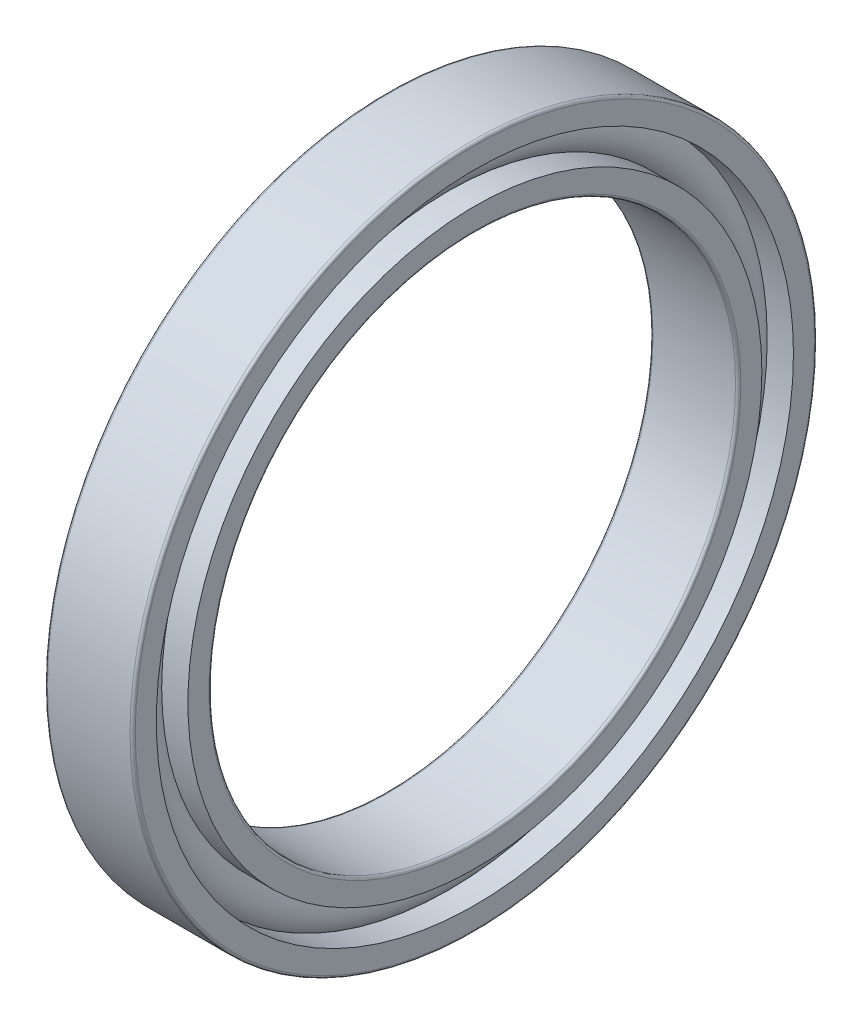
ISO-10303-21;
HEADER;
FILE_DESCRIPTION(('STEP AP214'),'2;1');
FILE_NAME('part.step','',(''),(''),'','','');
FILE_SCHEMA(('AUTOMOTIVE_DESIGN { 1 0 10303 214 1 1 1 1 }'));
ENDSEC;
DATA;
#1=APPLICATION_CONTEXT('core data for automotive mechanical design processes');
#2=APPLICATION_PROTOCOL_DEFINITION('international standard','automotive_design',2000,#1);
#3=PRODUCT_CONTEXT('',#1,'mechanical');
#4=PRODUCT('Part','Part','',(#3));
#5=PRODUCT_RELATED_PRODUCT_CATEGORY('part','',(#4));
#6=PRODUCT_DEFINITION_FORMATION('','',#4);
#7=PRODUCT_DEFINITION_CONTEXT('part definition',#1,'design');
#8=PRODUCT_DEFINITION('design','',#6,#7);
#9=PRODUCT_DEFINITION_SHAPE('','',#8);
#10=(LENGTH_UNIT() NAMED_UNIT(*) SI_UNIT(.MILLI.,.METRE.));
#11=(NAMED_UNIT(*) PLANE_ANGLE_UNIT() SI_UNIT($,.RADIAN.));
#12=(NAMED_UNIT(*) SI_UNIT($,.STERADIAN.) SOLID_ANGLE_UNIT());
#13=UNCERTAINTY_MEASURE_WITH_UNIT(LENGTH_MEASURE(1.E-05),#10,'distance_accuracy_value','');
#14=(GEOMETRIC_REPRESENTATION_CONTEXT(3) GLOBAL_UNCERTAINTY_ASSIGNED_CONTEXT((#13)) GLOBAL_UNIT_ASSIGNED_CONTEXT((#10,
#11,#12)) REPRESENTATION_CONTEXT('',''));
#15=CARTESIAN_POINT('',(0.,0.,0.));
#16=DIRECTION('',(0.,0.,1.));
#17=DIRECTION('',(1.,0.,0.));
#18=AXIS2_PLACEMENT_3D('',#15,#16,#17);
#19=CARTESIAN_POINT('',(-56.485389628222,6.15435119756746,25.6253948846519));
#20=DIRECTION('',(-1.,0.,0.));
#21=DIRECTION('',(0.,0.,1.));
#22=AXIS2_PLACEMENT_3D('',#19,#20,#21);
#23=TOROIDAL_SURFACE('',#22,34.5,2.7);
#24=CARTESIAN_POINT('',(-54.4729284484722,6.15435119756746,25.6253948846519));
#25=DIRECTION('',(-1.,0.,0.));
#26=DIRECTION('',(0.,0.,1.));
#27=AXIS2_PLACEMENT_3D('',#24,#25,#26);
#28=CIRCLE('',#27,36.3);
#29=CARTESIAN_POINT('',(-54.4729284484722,6.15435119756746,61.9253948846519));
#30=VERTEX_POINT('',#29);
#31=EDGE_CURVE('E45',#30,#30,#28,.F.);
#32=ORIENTED_EDGE('',*,*,#31,.T.);
#33=EDGE_LOOP('',(#32));
#34=FACE_BOUND('',#33,.T.);
#35=CARTESIAN_POINT('',(-54.4729284484722,6.15435119756746,25.6253948846519));
#36=DIRECTION('',(-1.,0.,0.));
#37=DIRECTION('',(0.,0.,1.));
#38=AXIS2_PLACEMENT_3D('',#35,#36,#37);
#39=CIRCLE('',#38,32.7);
#40=CARTESIAN_POINT('',(-54.4729284484722,6.15435119756746,58.3253948846519));
#41=VERTEX_POINT('',#40);
#42=EDGE_CURVE('E10',#41,#41,#39,.T.);
#43=ORIENTED_EDGE('',*,*,#42,.T.);
#44=EDGE_LOOP('',(#43));
#45=FACE_BOUND('',#44,.T.);
#46=ADVANCED_FACE('F41',(#34,#45),#23,.T.);
#47=CARTESIAN_POINT('',(-77.122889628222,6.15435119756746,25.6253948846519));
#48=DIRECTION('',(1.,0.,0.));
#49=DIRECTION('',(0.,0.,-1.));
#50=AXIS2_PLACEMENT_3D('',#47,#48,#49);
#51=CYLINDRICAL_SURFACE('',#50,32.7);
#52=CARTESIAN_POINT('',(-51.485389628222,6.15435119756746,25.6253948846519));
#53=DIRECTION('',(1.,0.,0.));
#54=DIRECTION('',(0.,0.,-1.));
#55=AXIS2_PLACEMENT_3D('',#52,#53,#54);
#56=CIRCLE('',#55,32.7);
#57=CARTESIAN_POINT('',(-51.485389628222,6.15435119756746,-7.07460511534808));
#58=VERTEX_POINT('',#57);
#59=EDGE_CURVE('E56',#58,#58,#56,.T.);
#60=ORIENTED_EDGE('',*,*,#59,.F.);
#61=EDGE_LOOP('',(#60));
#62=FACE_BOUND('',#61,.T.);
#63=ORIENTED_EDGE('',*,*,#42,.F.);
#64=EDGE_LOOP('',(#63));
#65=FACE_BOUND('',#64,.T.);
#66=ADVANCED_FACE('F105',(#62,#65),#51,.T.);
#67=CARTESIAN_POINT('',(-77.122889628222,6.15435119756746,25.6253948846519));
#68=DIRECTION('',(1.,0.,0.));
#69=DIRECTION('',(0.,0.,-1.));
#70=AXIS2_PLACEMENT_3D('',#67,#68,#69);
#71=CYLINDRICAL_SURFACE('',#70,32.7);
#72=CARTESIAN_POINT('',(-61.485389628222,6.15435119756746,25.6253948846519));
#73=DIRECTION('',(1.,0.,0.));
#74=DIRECTION('',(0.,0.,-1.));
#75=AXIS2_PLACEMENT_3D('',#72,#73,#74);
#76=CIRCLE('',#75,32.7);
#77=CARTESIAN_POINT('',(-61.485389628222,6.15435119756746,-7.07460511534808));
#78=VERTEX_POINT('',#77);
#79=EDGE_CURVE('E68',#78,#78,#76,.T.);
#80=ORIENTED_EDGE('',*,*,#79,.T.);
#81=EDGE_LOOP('',(#80));
#82=FACE_BOUND('',#81,.T.);
#83=CARTESIAN_POINT('',(-58.4978508079718,6.15435119756746,25.6253948846519));
#84=DIRECTION('',(1.,0.,0.));
#85=DIRECTION('',(0.,0.,-1.));
#86=AXIS2_PLACEMENT_3D('',#83,#84,#85);
#87=CIRCLE('',#86,32.7);
#88=CARTESIAN_POINT('',(-58.4978508079718,6.15435119756746,-7.07460511534808));
#89=VERTEX_POINT('',#88);
#90=EDGE_CURVE('E50',#89,#89,#87,.T.);
#91=ORIENTED_EDGE('',*,*,#90,.F.);
#92=EDGE_LOOP('',(#91));
#93=FACE_BOUND('',#92,.T.);
#94=ADVANCED_FACE('F108',(#82,#93),#71,.T.);
#95=CARTESIAN_POINT('',(-51.485389628222,36.4543511975675,25.6253948846519));
#96=DIRECTION('',(1.,0.,0.));
#97=DIRECTION('',(0.,0.,-1.));
#98=AXIS2_PLACEMENT_3D('',#95,#96,#97);
#99=PLANE('',#98);
#100=ORIENTED_EDGE('',*,*,#59,.T.);
#101=EDGE_LOOP('',(#100));
#102=FACE_BOUND('',#101,.T.);
#103=CARTESIAN_POINT('',(-51.485389628222,6.15435119756746,25.6253948846519));
#104=DIRECTION('',(1.,0.,0.));
#105=DIRECTION('',(0.,0.,-1.));
#106=AXIS2_PLACEMENT_3D('',#103,#104,#105);
#107=CIRCLE('',#106,30.3);
#108=CARTESIAN_POINT('',(-51.485389628222,6.15435119756746,-4.67460511534808));
#109=VERTEX_POINT('',#108);
#110=EDGE_CURVE('E95',#109,#109,#107,.T.);
#111=ORIENTED_EDGE('',*,*,#110,.F.);
#112=EDGE_LOOP('',(#111));
#113=FACE_BOUND('',#112,.T.);
#114=ADVANCED_FACE('F102',(#102,#113),#99,.T.);
#115=CARTESIAN_POINT('',(-51.785389628222,6.15435119756746,25.6253948846519));
#116=DIRECTION('',(1.,0.,0.));
#117=DIRECTION('',(0.,0.,-1.));
#118=AXIS2_PLACEMENT_3D('',#115,#116,#117);
#119=TOROIDAL_SURFACE('',#118,30.3,0.300000000000004);
#120=ORIENTED_EDGE('',*,*,#110,.T.);
#121=EDGE_LOOP('',(#120));
#122=FACE_BOUND('',#121,.T.);
#123=CARTESIAN_POINT('',(-51.785389628222,6.15435119756746,25.6253948846519));
#124=DIRECTION('',(1.,0.,0.));
#125=DIRECTION('',(0.,0.,-1.));
#126=AXIS2_PLACEMENT_3D('',#123,#124,#125);
#127=CIRCLE('',#126,30.);
#128=CARTESIAN_POINT('',(-51.785389628222,6.15435119756746,-4.37460511534807));
#129=VERTEX_POINT('',#128);
#130=EDGE_CURVE('E91',#129,#129,#127,.T.);
#131=ORIENTED_EDGE('',*,*,#130,.F.);
#132=EDGE_LOOP('',(#131));
#133=FACE_BOUND('',#132,.T.);
#134=ADVANCED_FACE('F119',(#122,#133),#119,.T.);
#135=CARTESIAN_POINT('',(-77.122889628222,6.15435119756746,25.6253948846519));
#136=DIRECTION('',(1.,0.,0.));
#137=DIRECTION('',(0.,0.,-1.));
#138=AXIS2_PLACEMENT_3D('',#135,#136,#137);
#139=CYLINDRICAL_SURFACE('',#138,30.);
#140=ORIENTED_EDGE('',*,*,#130,.T.);
#141=EDGE_LOOP('',(#140));
#142=FACE_BOUND('',#141,.T.);
#143=CARTESIAN_POINT('',(-61.185389628222,6.15435119756746,25.6253948846519));
#144=DIRECTION('',(1.,0.,0.));
#145=DIRECTION('',(0.,0.,-1.));
#146=AXIS2_PLACEMENT_3D('',#143,#144,#145);
#147=CIRCLE('',#146,30.);
#148=CARTESIAN_POINT('',(-61.185389628222,6.15435119756746,-4.37460511534808));
#149=VERTEX_POINT('',#148);
#150=EDGE_CURVE('E87',#149,#149,#147,.T.);
#151=ORIENTED_EDGE('',*,*,#150,.F.);
#152=EDGE_LOOP('',(#151));
#153=FACE_BOUND('',#152,.T.);
#154=ADVANCED_FACE('F122',(#142,#153),#139,.F.);
#155=CARTESIAN_POINT('',(-61.185389628222,6.15435119756746,25.6253948846519));
#156=DIRECTION('',(1.,0.,0.));
#157=DIRECTION('',(0.,0.,-1.));
#158=AXIS2_PLACEMENT_3D('',#155,#156,#157);
#159=TOROIDAL_SURFACE('',#158,30.3,0.300000000000004);
#160=ORIENTED_EDGE('',*,*,#150,.T.);
#161=EDGE_LOOP('',(#160));
#162=FACE_BOUND('',#161,.T.);
#163=CARTESIAN_POINT('',(-61.485389628222,6.15435119756746,25.6253948846519));
#164=DIRECTION('',(1.,0.,0.));
#165=DIRECTION('',(0.,0.,-1.));
#166=AXIS2_PLACEMENT_3D('',#163,#164,#165);
#167=CIRCLE('',#166,30.3);
#168=CARTESIAN_POINT('',(-61.485389628222,6.15435119756746,-4.67460511534808));
#169=VERTEX_POINT('',#168);
#170=EDGE_CURVE('E83',#169,#169,#167,.T.);
#171=ORIENTED_EDGE('',*,*,#170,.F.);
#172=EDGE_LOOP('',(#171));
#173=FACE_BOUND('',#172,.T.);
#174=ADVANCED_FACE('F126',(#162,#173),#159,.T.);
#175=CARTESIAN_POINT('',(-61.485389628222,38.8543511975675,25.6253948846519));
#176=DIRECTION('',(-1.,0.,0.));
#177=DIRECTION('',(0.,0.,1.));
#178=AXIS2_PLACEMENT_3D('',#175,#176,#177);
#179=PLANE('',#178);
#180=ORIENTED_EDGE('',*,*,#170,.T.);
#181=EDGE_LOOP('',(#180));
#182=FACE_BOUND('',#181,.T.);
#183=ORIENTED_EDGE('',*,*,#79,.F.);
#184=EDGE_LOOP('',(#183));
#185=FACE_BOUND('',#184,.T.);
#186=ADVANCED_FACE('F130',(#182,#185),#179,.T.);
#187=CARTESIAN_POINT('',(-58.4978508079718,6.15435119756746,25.6253948846519));
#188=DIRECTION('',(1.,0.,0.));
#189=DIRECTION('',(0.,0.,-1.));
#190=AXIS2_PLACEMENT_3D('',#187,#188,#189);
#191=CIRCLE('',#190,36.3);
#192=CARTESIAN_POINT('',(-58.4978508079718,6.15435119756746,-10.6746051153481));
#193=VERTEX_POINT('',#192);
#194=EDGE_CURVE('E59',#193,#193,#191,.F.);
#195=ORIENTED_EDGE('',*,*,#194,.T.);
#196=EDGE_LOOP('',(#195));
#197=FACE_BOUND('',#196,.T.);
#198=ORIENTED_EDGE('',*,*,#90,.T.);
#199=EDGE_LOOP('',(#198));
#200=FACE_BOUND('',#199,.T.);
#201=ADVANCED_FACE('F43',(#197,#200),#23,.T.);
#202=CARTESIAN_POINT('',(-77.122889628222,6.15435119756746,25.6253948846519));
#203=DIRECTION('',(1.,0.,0.));
#204=DIRECTION('',(0.,0.,-1.));
#205=AXIS2_PLACEMENT_3D('',#202,#203,#204);
#206=CYLINDRICAL_SURFACE('',#205,36.3);
#207=CARTESIAN_POINT('',(-51.485389628222,6.15435119756746,25.6253948846519));
#208=DIRECTION('',(1.,0.,0.));
#209=DIRECTION('',(0.,0.,-1.));
#210=AXIS2_PLACEMENT_3D('',#207,#208,#209);
#211=CIRCLE('',#210,36.3);
#212=CARTESIAN_POINT('',(-51.485389628222,6.15435119756746,-10.6746051153481));
#213=VERTEX_POINT('',#212);
#214=EDGE_CURVE('E62',#213,#213,#211,.T.);
#215=ORIENTED_EDGE('',*,*,#214,.T.);
#216=EDGE_LOOP('',(#215));
#217=FACE_BOUND('',#216,.T.);
#218=ORIENTED_EDGE('',*,*,#31,.F.);
#219=EDGE_LOOP('',(#218));
#220=FACE_BOUND('',#219,.T.);
#221=ADVANCED_FACE('F135',(#217,#220),#206,.F.);
#222=CARTESIAN_POINT('',(-77.122889628222,6.15435119756746,25.6253948846519));
#223=DIRECTION('',(1.,0.,0.));
#224=DIRECTION('',(0.,0.,-1.));
#225=AXIS2_PLACEMENT_3D('',#222,#223,#224);
#226=CYLINDRICAL_SURFACE('',#225,36.3);
#227=CARTESIAN_POINT('',(-61.485389628222,6.15435119756746,25.6253948846519));
#228=DIRECTION('',(1.,0.,0.));
#229=DIRECTION('',(0.,0.,-1.));
#230=AXIS2_PLACEMENT_3D('',#227,#228,#229);
#231=CIRCLE('',#230,36.3);
#232=CARTESIAN_POINT('',(-61.485389628222,6.15435119756746,-10.6746051153481));
#233=VERTEX_POINT('',#232);
#234=EDGE_CURVE('E166',#233,#233,#231,.T.);
#235=ORIENTED_EDGE('',*,*,#234,.F.);
#236=EDGE_LOOP('',(#235));
#237=FACE_BOUND('',#236,.T.);
#238=ORIENTED_EDGE('',*,*,#194,.F.);
#239=EDGE_LOOP('',(#238));
#240=FACE_BOUND('',#239,.T.);
#241=ADVANCED_FACE('F138',(#237,#240),#226,.F.);
#242=CARTESIAN_POINT('',(-51.485389628222,44.8543511975675,25.6253948846519));
#243=DIRECTION('',(1.,0.,0.));
#244=DIRECTION('',(0.,0.,-1.));
#245=AXIS2_PLACEMENT_3D('',#242,#243,#244);
#246=PLANE('',#245);
#247=CARTESIAN_POINT('',(-51.485389628222,6.15435119756746,25.6253948846519));
#248=DIRECTION('',(1.,0.,0.));
#249=DIRECTION('',(0.,0.,-1.));
#250=AXIS2_PLACEMENT_3D('',#247,#248,#249);
#251=CIRCLE('',#250,38.7);
#252=CARTESIAN_POINT('',(-51.485389628222,6.15435119756746,-13.0746051153481));
#253=VERTEX_POINT('',#252);
#254=EDGE_CURVE('E70',#253,#253,#251,.T.);
#255=ORIENTED_EDGE('',*,*,#254,.T.);
#256=EDGE_LOOP('',(#255));
#257=FACE_BOUND('',#256,.T.);
#258=ORIENTED_EDGE('',*,*,#214,.F.);
#259=EDGE_LOOP('',(#258));
#260=FACE_BOUND('',#259,.T.);
#261=ADVANCED_FACE('F139',(#257,#260),#246,.T.);
#262=CARTESIAN_POINT('',(-51.785389628222,6.15435119756746,25.6253948846519));
#263=DIRECTION('',(1.,0.,0.));
#264=DIRECTION('',(0.,0.,-1.));
#265=AXIS2_PLACEMENT_3D('',#262,#263,#264);
#266=TOROIDAL_SURFACE('',#265,38.7,0.300000000000004);
#267=CARTESIAN_POINT('',(-51.785389628222,6.15435119756746,25.6253948846519));
#268=DIRECTION('',(1.,0.,0.));
#269=DIRECTION('',(0.,0.,-1.));
#270=AXIS2_PLACEMENT_3D('',#267,#268,#269);
#271=CIRCLE('',#270,39.);
#272=CARTESIAN_POINT('',(-51.785389628222,6.15435119756746,-13.3746051153481));
#273=VERTEX_POINT('',#272);
#274=EDGE_CURVE('E76',#273,#273,#271,.T.);
#275=ORIENTED_EDGE('',*,*,#274,.T.);
#276=EDGE_LOOP('',(#275));
#277=FACE_BOUND('',#276,.T.);
#278=ORIENTED_EDGE('',*,*,#254,.F.);
#279=EDGE_LOOP('',(#278));
#280=FACE_BOUND('',#279,.T.);
#281=ADVANCED_FACE('F142',(#277,#280),#266,.T.);
#282=CARTESIAN_POINT('',(-77.122889628222,6.15435119756746,25.6253948846519));
#283=DIRECTION('',(1.,0.,0.));
#284=DIRECTION('',(0.,0.,-1.));
#285=AXIS2_PLACEMENT_3D('',#282,#283,#284);
#286=CYLINDRICAL_SURFACE('',#285,39.);
#287=CARTESIAN_POINT('',(-61.185389628222,6.15435119756746,25.6253948846519));
#288=DIRECTION('',(1.,0.,0.));
#289=DIRECTION('',(0.,0.,-1.));
#290=AXIS2_PLACEMENT_3D('',#287,#288,#289);
#291=CIRCLE('',#290,39.);
#292=CARTESIAN_POINT('',(-61.185389628222,6.15435119756746,-13.3746051153481));
#293=VERTEX_POINT('',#292);
#294=EDGE_CURVE('E172',#293,#293,#291,.T.);
#295=ORIENTED_EDGE('',*,*,#294,.T.);
#296=EDGE_LOOP('',(#295));
#297=FACE_BOUND('',#296,.T.);
#298=ORIENTED_EDGE('',*,*,#274,.F.);
#299=EDGE_LOOP('',(#298));
#300=FACE_BOUND('',#299,.T.);
#301=ADVANCED_FACE('F146',(#297,#300),#286,.T.);
#302=CARTESIAN_POINT('',(-61.185389628222,6.15435119756746,25.6253948846519));
#303=DIRECTION('',(1.,0.,0.));
#304=DIRECTION('',(0.,0.,-1.));
#305=AXIS2_PLACEMENT_3D('',#302,#303,#304);
#306=TOROIDAL_SURFACE('',#305,38.7,0.300000000000004);
#307=CARTESIAN_POINT('',(-61.485389628222,6.15435119756746,25.6253948846519));
#308=DIRECTION('',(1.,0.,0.));
#309=DIRECTION('',(0.,0.,-1.));
#310=AXIS2_PLACEMENT_3D('',#307,#308,#309);
#311=CIRCLE('',#310,38.7);
#312=CARTESIAN_POINT('',(-61.485389628222,6.15435119756746,-13.0746051153481));
#313=VERTEX_POINT('',#312);
#314=EDGE_CURVE('E168',#313,#313,#311,.T.);
#315=ORIENTED_EDGE('',*,*,#314,.T.);
#316=EDGE_LOOP('',(#315));
#317=FACE_BOUND('',#316,.T.);
#318=ORIENTED_EDGE('',*,*,#294,.F.);
#319=EDGE_LOOP('',(#318));
#320=FACE_BOUND('',#319,.T.);
#321=ADVANCED_FACE('F150',(#317,#320),#306,.T.);
#322=CARTESIAN_POINT('',(-61.485389628222,42.4543511975675,25.6253948846519));
#323=DIRECTION('',(-1.,0.,0.));
#324=DIRECTION('',(0.,0.,1.));
#325=AXIS2_PLACEMENT_3D('',#322,#323,#324);
#326=PLANE('',#325);
#327=ORIENTED_EDGE('',*,*,#234,.T.);
#328=EDGE_LOOP('',(#327));
#329=FACE_BOUND('',#328,.T.);
#330=ORIENTED_EDGE('',*,*,#314,.F.);
#331=EDGE_LOOP('',(#330));
#332=FACE_BOUND('',#331,.T.);
#333=ADVANCED_FACE('F154',(#329,#332),#326,.T.);
#334=CLOSED_SHELL('',(#46,#66,#94,#114,#134,#154,#174,#186,#201,#221,#241,#261,#281,#301,#321,#333));
#335=MANIFOLD_SOLID_BREP('B2',#334);
#336=ADVANCED_BREP_SHAPE_REPRESENTATION('',(#18,#335),#14);
#337=SHAPE_DEFINITION_REPRESENTATION(#9,#336);
ENDSEC;
END-ISO-10303-21;
